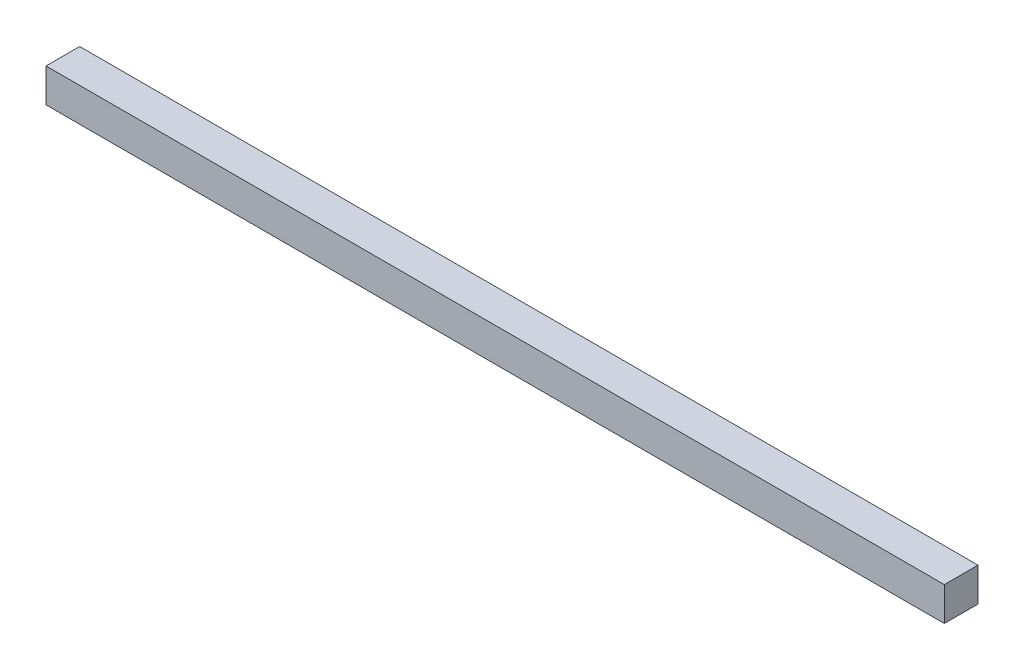
ISO-10303-21;
HEADER;
FILE_DESCRIPTION(('STEP AP214'),'2;1');
FILE_NAME('part.step','',(''),(''),'','','');
FILE_SCHEMA(('AUTOMOTIVE_DESIGN { 1 0 10303 214 1 1 1 1 }'));
ENDSEC;
DATA;
#1=APPLICATION_CONTEXT('core data for automotive mechanical design processes');
#2=APPLICATION_PROTOCOL_DEFINITION('international standard','automotive_design',2000,#1);
#3=PRODUCT_CONTEXT('',#1,'mechanical');
#4=PRODUCT('Part','Part','',(#3));
#5=PRODUCT_RELATED_PRODUCT_CATEGORY('part','',(#4));
#6=PRODUCT_DEFINITION_FORMATION('','',#4);
#7=PRODUCT_DEFINITION_CONTEXT('part definition',#1,'design');
#8=PRODUCT_DEFINITION('design','',#6,#7);
#9=PRODUCT_DEFINITION_SHAPE('','',#8);
#10=(LENGTH_UNIT() NAMED_UNIT(*) SI_UNIT(.MILLI.,.METRE.));
#11=(NAMED_UNIT(*) PLANE_ANGLE_UNIT() SI_UNIT($,.RADIAN.));
#12=(NAMED_UNIT(*) SI_UNIT($,.STERADIAN.) SOLID_ANGLE_UNIT());
#13=UNCERTAINTY_MEASURE_WITH_UNIT(LENGTH_MEASURE(1.E-05),#10,'distance_accuracy_value','');
#14=(GEOMETRIC_REPRESENTATION_CONTEXT(3) GLOBAL_UNCERTAINTY_ASSIGNED_CONTEXT((#13)) GLOBAL_UNIT_ASSIGNED_CONTEXT((#10,
#11,#12)) REPRESENTATION_CONTEXT('',''));
#15=CARTESIAN_POINT('',(0.,0.,0.));
#16=DIRECTION('',(0.,0.,1.));
#17=DIRECTION('',(1.,0.,0.));
#18=AXIS2_PLACEMENT_3D('',#15,#16,#17);
#19=CARTESIAN_POINT('',(0.,30.,0.));
#20=DIRECTION('',(1.,0.,0.));
#21=DIRECTION('',(0.,0.,-1.));
#22=AXIS2_PLACEMENT_3D('',#19,#20,#21);
#23=PLANE('',#22);
#24=DIRECTION('',(0.,0.,1.));
#25=VECTOR('',#24,1.);
#26=CARTESIAN_POINT('',(0.,0.,0.));
#27=LINE('',#26,#25);
#28=CARTESIAN_POINT('',(0.,0.,-30.));
#29=VERTEX_POINT('',#28);
#30=CARTESIAN_POINT('',(0.,0.,0.));
#31=VERTEX_POINT('',#30);
#32=EDGE_CURVE('E96',#29,#31,#27,.T.);
#33=ORIENTED_EDGE('',*,*,#32,.T.);
#34=DIRECTION('',(0.,-1.,0.));
#35=VECTOR('',#34,1.);
#36=CARTESIAN_POINT('',(0.,30.,0.));
#37=LINE('',#36,#35);
#38=CARTESIAN_POINT('',(0.,30.,0.));
#39=VERTEX_POINT('',#38);
#40=EDGE_CURVE('E11',#39,#31,#37,.T.);
#41=ORIENTED_EDGE('',*,*,#40,.F.);
#42=DIRECTION('',(0.,0.,1.));
#43=VECTOR('',#42,1.);
#44=CARTESIAN_POINT('',(0.,30.,0.));
#45=LINE('',#44,#43);
#46=CARTESIAN_POINT('',(0.,30.,-30.));
#47=VERTEX_POINT('',#46);
#48=EDGE_CURVE('E84',#47,#39,#45,.T.);
#49=ORIENTED_EDGE('',*,*,#48,.F.);
#50=DIRECTION('',(0.,-1.,0.));
#51=VECTOR('',#50,1.);
#52=CARTESIAN_POINT('',(0.,30.,-30.));
#53=LINE('',#52,#51);
#54=EDGE_CURVE('E92',#47,#29,#53,.T.);
#55=ORIENTED_EDGE('',*,*,#54,.T.);
#56=EDGE_LOOP('',(#33,#41,#49,#55));
#57=FACE_BOUND('',#56,.T.);
#58=ADVANCED_FACE('F33',(#57),#23,.F.);
#59=CARTESIAN_POINT('',(0.,30.,0.));
#60=DIRECTION('',(0.,0.,-1.));
#61=DIRECTION('',(-1.,0.,0.));
#62=AXIS2_PLACEMENT_3D('',#59,#60,#61);
#63=PLANE('',#62);
#64=DIRECTION('',(1.,0.,0.));
#65=VECTOR('',#64,1.);
#66=CARTESIAN_POINT('',(0.,0.,0.));
#67=LINE('',#66,#65);
#68=CARTESIAN_POINT('',(800.,0.,0.));
#69=VERTEX_POINT('',#68);
#70=EDGE_CURVE('E88',#31,#69,#67,.T.);
#71=ORIENTED_EDGE('',*,*,#70,.T.);
#72=DIRECTION('',(0.,-1.,0.));
#73=VECTOR('',#72,1.);
#74=CARTESIAN_POINT('',(800.,30.,0.));
#75=LINE('',#74,#73);
#76=CARTESIAN_POINT('',(800.,30.,0.));
#77=VERTEX_POINT('',#76);
#78=EDGE_CURVE('E41',#77,#69,#75,.T.);
#79=ORIENTED_EDGE('',*,*,#78,.F.);
#80=DIRECTION('',(1.,0.,0.));
#81=VECTOR('',#80,1.);
#82=CARTESIAN_POINT('',(0.,30.,0.));
#83=LINE('',#82,#81);
#84=EDGE_CURVE('E79',#39,#77,#83,.T.);
#85=ORIENTED_EDGE('',*,*,#84,.F.);
#86=ORIENTED_EDGE('',*,*,#40,.T.);
#87=EDGE_LOOP('',(#71,#79,#85,#86));
#88=FACE_BOUND('',#87,.T.);
#89=ADVANCED_FACE('F87',(#88),#63,.F.);
#90=CARTESIAN_POINT('',(800.,30.,0.));
#91=DIRECTION('',(-1.,0.,0.));
#92=DIRECTION('',(0.,0.,1.));
#93=AXIS2_PLACEMENT_3D('',#90,#91,#92);
#94=PLANE('',#93);
#95=DIRECTION('',(0.,0.,-1.));
#96=VECTOR('',#95,1.);
#97=CARTESIAN_POINT('',(800.,0.,0.));
#98=LINE('',#97,#96);
#99=CARTESIAN_POINT('',(800.,0.,-30.));
#100=VERTEX_POINT('',#99);
#101=EDGE_CURVE('E66',#69,#100,#98,.T.);
#102=ORIENTED_EDGE('',*,*,#101,.T.);
#103=DIRECTION('',(0.,-1.,0.));
#104=VECTOR('',#103,1.);
#105=CARTESIAN_POINT('',(800.,30.,-30.));
#106=LINE('',#105,#104);
#107=CARTESIAN_POINT('',(800.,30.,-30.));
#108=VERTEX_POINT('',#107);
#109=EDGE_CURVE('E89',#108,#100,#106,.T.);
#110=ORIENTED_EDGE('',*,*,#109,.F.);
#111=DIRECTION('',(0.,0.,-1.));
#112=VECTOR('',#111,1.);
#113=CARTESIAN_POINT('',(800.,30.,0.));
#114=LINE('',#113,#112);
#115=EDGE_CURVE('E82',#77,#108,#114,.T.);
#116=ORIENTED_EDGE('',*,*,#115,.F.);
#117=ORIENTED_EDGE('',*,*,#78,.T.);
#118=EDGE_LOOP('',(#102,#110,#116,#117));
#119=FACE_BOUND('',#118,.T.);
#120=ADVANCED_FACE('F90',(#119),#94,.F.);
#121=CARTESIAN_POINT('',(0.,30.,-30.));
#122=DIRECTION('',(0.,0.,1.));
#123=DIRECTION('',(1.,0.,0.));
#124=AXIS2_PLACEMENT_3D('',#121,#122,#123);
#125=PLANE('',#124);
#126=DIRECTION('',(-1.,0.,0.));
#127=VECTOR('',#126,1.);
#128=CARTESIAN_POINT('',(0.,0.,-30.));
#129=LINE('',#128,#127);
#130=EDGE_CURVE('E72',#100,#29,#129,.T.);
#131=ORIENTED_EDGE('',*,*,#130,.T.);
#132=ORIENTED_EDGE('',*,*,#54,.F.);
#133=DIRECTION('',(-1.,0.,0.));
#134=VECTOR('',#133,1.);
#135=CARTESIAN_POINT('',(0.,30.,-30.));
#136=LINE('',#135,#134);
#137=EDGE_CURVE('E49',#108,#47,#136,.T.);
#138=ORIENTED_EDGE('',*,*,#137,.F.);
#139=ORIENTED_EDGE('',*,*,#109,.T.);
#140=EDGE_LOOP('',(#131,#132,#138,#139));
#141=FACE_BOUND('',#140,.T.);
#142=ADVANCED_FACE('F103',(#141),#125,.F.);
#143=CARTESIAN_POINT('',(0.,30.,0.));
#144=DIRECTION('',(0.,-1.,0.));
#145=DIRECTION('',(0.,0.,-1.));
#146=AXIS2_PLACEMENT_3D('',#143,#144,#145);
#147=PLANE('',#146);
#148=ORIENTED_EDGE('',*,*,#48,.T.);
#149=ORIENTED_EDGE('',*,*,#84,.T.);
#150=ORIENTED_EDGE('',*,*,#115,.T.);
#151=ORIENTED_EDGE('',*,*,#137,.T.);
#152=EDGE_LOOP('',(#148,#149,#150,#151));
#153=FACE_BOUND('',#152,.T.);
#154=ADVANCED_FACE('F80',(#153),#147,.F.);
#155=CARTESIAN_POINT('',(0.,0.,0.));
#156=DIRECTION('',(0.,-1.,0.));
#157=DIRECTION('',(0.,0.,-1.));
#158=AXIS2_PLACEMENT_3D('',#155,#156,#157);
#159=PLANE('',#158);
#160=ORIENTED_EDGE('',*,*,#32,.F.);
#161=ORIENTED_EDGE('',*,*,#130,.F.);
#162=ORIENTED_EDGE('',*,*,#101,.F.);
#163=ORIENTED_EDGE('',*,*,#70,.F.);
#164=EDGE_LOOP('',(#160,#161,#162,#163));
#165=FACE_BOUND('',#164,.T.);
#166=ADVANCED_FACE('F106',(#165),#159,.T.);
#167=CLOSED_SHELL('',(#58,#89,#120,#142,#154,#166));
#168=MANIFOLD_SOLID_BREP('B2',#167);
#169=ADVANCED_BREP_SHAPE_REPRESENTATION('',(#18,#168),#14);
#170=SHAPE_DEFINITION_REPRESENTATION(#9,#169);
ENDSEC;
END-ISO-10303-21;
